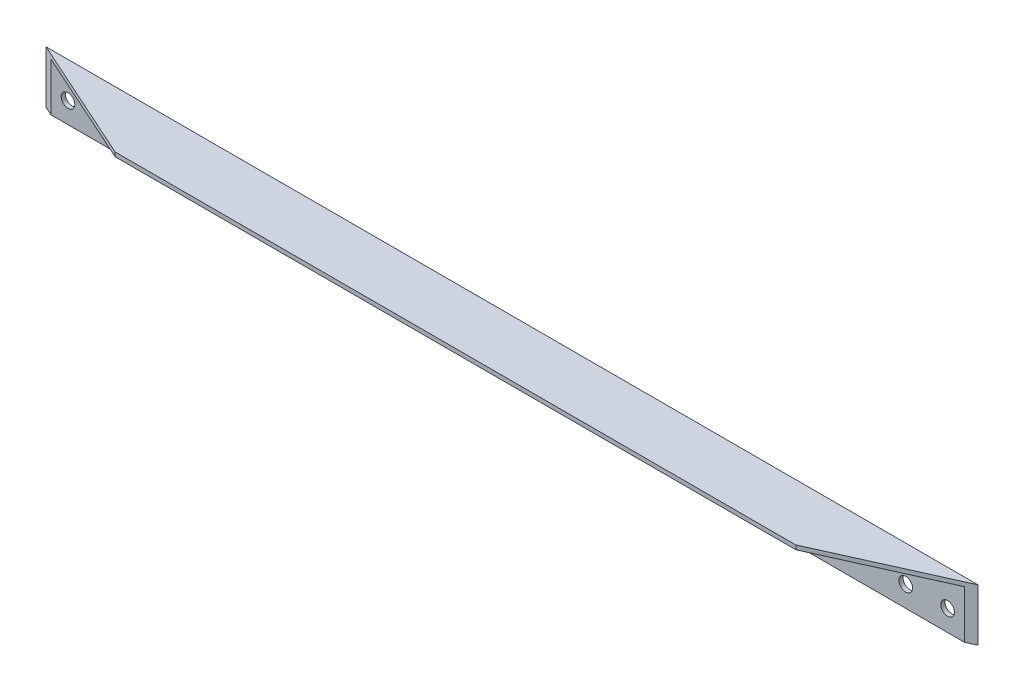
ISO-10303-21;
HEADER;
FILE_DESCRIPTION(('STEP AP214'),'2;1');
FILE_NAME('part.step','',(''),(''),'','','');
FILE_SCHEMA(('AUTOMOTIVE_DESIGN { 1 0 10303 214 1 1 1 1 }'));
ENDSEC;
DATA;
#1=APPLICATION_CONTEXT('core data for automotive mechanical design processes');
#2=APPLICATION_PROTOCOL_DEFINITION('international standard','automotive_design',2000,#1);
#3=PRODUCT_CONTEXT('',#1,'mechanical');
#4=PRODUCT('Part','Part','',(#3));
#5=PRODUCT_RELATED_PRODUCT_CATEGORY('part','',(#4));
#6=PRODUCT_DEFINITION_FORMATION('','',#4);
#7=PRODUCT_DEFINITION_CONTEXT('part definition',#1,'design');
#8=PRODUCT_DEFINITION('design','',#6,#7);
#9=PRODUCT_DEFINITION_SHAPE('','',#8);
#10=(LENGTH_UNIT() NAMED_UNIT(*) SI_UNIT(.MILLI.,.METRE.));
#11=(NAMED_UNIT(*) PLANE_ANGLE_UNIT() SI_UNIT($,.RADIAN.));
#12=(NAMED_UNIT(*) SI_UNIT($,.STERADIAN.) SOLID_ANGLE_UNIT());
#13=UNCERTAINTY_MEASURE_WITH_UNIT(LENGTH_MEASURE(1.E-05),#10,'distance_accuracy_value','');
#14=(GEOMETRIC_REPRESENTATION_CONTEXT(3) GLOBAL_UNCERTAINTY_ASSIGNED_CONTEXT((#13)) GLOBAL_UNIT_ASSIGNED_CONTEXT((#10,
#11,#12)) REPRESENTATION_CONTEXT('',''));
#15=CARTESIAN_POINT('',(0.,0.,0.));
#16=DIRECTION('',(0.,0.,1.));
#17=DIRECTION('',(1.,0.,0.));
#18=AXIS2_PLACEMENT_3D('',#15,#16,#17);
#19=CARTESIAN_POINT('',(-890.,100.,8.));
#20=DIRECTION('',(0.,0.,-1.));
#21=DIRECTION('',(-1.,0.,0.));
#22=AXIS2_PLACEMENT_3D('',#19,#20,#21);
#23=PLANE('',#22);
#24=CARTESIAN_POINT('',(-760.,39.9999999999999,8.));
#25=DIRECTION('',(0.,0.,1.));
#26=DIRECTION('',(-1.,0.,0.));
#27=AXIS2_PLACEMENT_3D('',#24,#25,#26);
#28=CIRCLE('',#27,12.9999999999998);
#29=CARTESIAN_POINT('',(-773.,39.9999999999999,8.));
#30=VERTEX_POINT('',#29);
#31=EDGE_CURVE('E134',#30,#30,#28,.T.);
#32=ORIENTED_EDGE('',*,*,#31,.F.);
#33=EDGE_LOOP('',(#32));
#34=FACE_BOUND('',#33,.T.);
#35=CARTESIAN_POINT('',(-840.,39.9999999999999,8.));
#36=DIRECTION('',(0.,0.,1.));
#37=DIRECTION('',(-1.,0.,0.));
#38=AXIS2_PLACEMENT_3D('',#35,#36,#37);
#39=CIRCLE('',#38,12.9999999999998);
#40=CARTESIAN_POINT('',(-853.,39.9999999999999,8.));
#41=VERTEX_POINT('',#40);
#42=EDGE_CURVE('E128',#41,#41,#39,.T.);
#43=ORIENTED_EDGE('',*,*,#42,.F.);
#44=EDGE_LOOP('',(#43));
#45=FACE_BOUND('',#44,.T.);
#46=CARTESIAN_POINT('',(760.,39.9999999999999,8.));
#47=DIRECTION('',(0.,0.,1.));
#48=DIRECTION('',(1.,0.,0.));
#49=AXIS2_PLACEMENT_3D('',#46,#47,#48);
#50=CIRCLE('',#49,12.9999999999998);
#51=CARTESIAN_POINT('',(773.,39.9999999999999,8.));
#52=VERTEX_POINT('',#51);
#53=EDGE_CURVE('E122',#52,#52,#50,.T.);
#54=ORIENTED_EDGE('',*,*,#53,.F.);
#55=EDGE_LOOP('',(#54));
#56=FACE_BOUND('',#55,.T.);
#57=CARTESIAN_POINT('',(840.,39.9999999999999,8.));
#58=DIRECTION('',(0.,0.,1.));
#59=DIRECTION('',(1.,0.,0.));
#60=AXIS2_PLACEMENT_3D('',#57,#58,#59);
#61=CIRCLE('',#60,12.9999999999998);
#62=CARTESIAN_POINT('',(853.,39.9999999999999,8.));
#63=VERTEX_POINT('',#62);
#64=EDGE_CURVE('E96',#63,#63,#61,.T.);
#65=ORIENTED_EDGE('',*,*,#64,.F.);
#66=EDGE_LOOP('',(#65));
#67=FACE_BOUND('',#66,.T.);
#68=DIRECTION('',(1.,0.,0.));
#69=VECTOR('',#68,1.);
#70=CARTESIAN_POINT('',(-890.,92.,8.));
#71=LINE('',#70,#69);
#72=CARTESIAN_POINT('',(-872.222222222222,92.,8.));
#73=VERTEX_POINT('',#72);
#74=CARTESIAN_POINT('',(872.222222222222,92.,8.00000000000001));
#75=VERTEX_POINT('',#74);
#76=EDGE_CURVE('E143',#73,#75,#71,.T.);
#77=ORIENTED_EDGE('',*,*,#76,.F.);
#78=DIRECTION('',(0.,-1.,0.));
#79=VECTOR('',#78,1.);
#80=CARTESIAN_POINT('',(-872.222222222222,100.,8.));
#81=LINE('',#80,#79);
#82=CARTESIAN_POINT('',(-872.222222222222,0.,7.99999999999999));
#83=VERTEX_POINT('',#82);
#84=EDGE_CURVE('E155',#73,#83,#81,.T.);
#85=ORIENTED_EDGE('',*,*,#84,.T.);
#86=DIRECTION('',(1.,0.,0.));
#87=VECTOR('',#86,1.);
#88=CARTESIAN_POINT('',(-890.,0.,8.));
#89=LINE('',#88,#87);
#90=CARTESIAN_POINT('',(872.222222222222,0.,7.99999999999995));
#91=VERTEX_POINT('',#90);
#92=EDGE_CURVE('E103',#83,#91,#89,.T.);
#93=ORIENTED_EDGE('',*,*,#92,.T.);
#94=DIRECTION('',(0.,1.,0.));
#95=VECTOR('',#94,1.);
#96=CARTESIAN_POINT('',(872.222222222222,100.,8.));
#97=LINE('',#96,#95);
#98=EDGE_CURVE('E146',#91,#75,#97,.T.);
#99=ORIENTED_EDGE('',*,*,#98,.T.);
#100=EDGE_LOOP('',(#77,#85,#93,#99));
#101=FACE_BOUND('',#100,.T.);
#102=ADVANCED_FACE('F33',(#34,#45,#56,#67,#101),#23,.F.);
#103=CARTESIAN_POINT('',(-890.,100.,0.));
#104=DIRECTION('',(0.,0.,-1.));
#105=DIRECTION('',(-1.,0.,0.));
#106=AXIS2_PLACEMENT_3D('',#103,#104,#105);
#107=PLANE('',#106);
#108=CARTESIAN_POINT('',(-840.,39.9999999999999,0.));
#109=DIRECTION('',(0.,0.,1.));
#110=DIRECTION('',(-1.,0.,0.));
#111=AXIS2_PLACEMENT_3D('',#108,#109,#110);
#112=CIRCLE('',#111,12.9999999999998);
#113=CARTESIAN_POINT('',(-853.,39.9999999999999,0.));
#114=VERTEX_POINT('',#113);
#115=EDGE_CURVE('E131',#114,#114,#112,.T.);
#116=ORIENTED_EDGE('',*,*,#115,.T.);
#117=EDGE_LOOP('',(#116));
#118=FACE_BOUND('',#117,.T.);
#119=CARTESIAN_POINT('',(840.,39.9999999999999,0.));
#120=DIRECTION('',(0.,0.,1.));
#121=DIRECTION('',(1.,0.,0.));
#122=AXIS2_PLACEMENT_3D('',#119,#120,#121);
#123=CIRCLE('',#122,12.9999999999998);
#124=CARTESIAN_POINT('',(853.,39.9999999999999,0.));
#125=VERTEX_POINT('',#124);
#126=EDGE_CURVE('E119',#125,#125,#123,.T.);
#127=ORIENTED_EDGE('',*,*,#126,.T.);
#128=EDGE_LOOP('',(#127));
#129=FACE_BOUND('',#128,.T.);
#130=DIRECTION('',(0.,-1.,0.));
#131=VECTOR('',#130,1.);
#132=CARTESIAN_POINT('',(-890.,0.,0.));
#133=LINE('',#132,#131);
#134=CARTESIAN_POINT('',(-890.,100.,0.));
#135=VERTEX_POINT('',#134);
#136=CARTESIAN_POINT('',(-890.,0.,0.));
#137=VERTEX_POINT('',#136);
#138=EDGE_CURVE('E84',#135,#137,#133,.T.);
#139=ORIENTED_EDGE('',*,*,#138,.F.);
#140=DIRECTION('',(-1.,0.,0.));
#141=VECTOR('',#140,1.);
#142=CARTESIAN_POINT('',(-890.,100.,0.));
#143=LINE('',#142,#141);
#144=CARTESIAN_POINT('',(890.,100.,0.));
#145=VERTEX_POINT('',#144);
#146=EDGE_CURVE('E109',#145,#135,#143,.T.);
#147=ORIENTED_EDGE('',*,*,#146,.F.);
#148=DIRECTION('',(0.,1.,0.));
#149=VECTOR('',#148,1.);
#150=CARTESIAN_POINT('',(890.,0.,0.));
#151=LINE('',#150,#149);
#152=CARTESIAN_POINT('',(890.,0.,0.));
#153=VERTEX_POINT('',#152);
#154=EDGE_CURVE('E107',#153,#145,#151,.T.);
#155=ORIENTED_EDGE('',*,*,#154,.F.);
#156=DIRECTION('',(1.,0.,0.));
#157=VECTOR('',#156,1.);
#158=CARTESIAN_POINT('',(-890.,0.,0.));
#159=LINE('',#158,#157);
#160=EDGE_CURVE('E95',#137,#153,#159,.T.);
#161=ORIENTED_EDGE('',*,*,#160,.F.);
#162=EDGE_LOOP('',(#139,#147,#155,#161));
#163=FACE_BOUND('',#162,.T.);
#164=CARTESIAN_POINT('',(760.,39.9999999999999,0.));
#165=DIRECTION('',(0.,0.,1.));
#166=DIRECTION('',(1.,0.,0.));
#167=AXIS2_PLACEMENT_3D('',#164,#165,#166);
#168=CIRCLE('',#167,12.9999999999998);
#169=CARTESIAN_POINT('',(773.,39.9999999999999,0.));
#170=VERTEX_POINT('',#169);
#171=EDGE_CURVE('E125',#170,#170,#168,.T.);
#172=ORIENTED_EDGE('',*,*,#171,.T.);
#173=EDGE_LOOP('',(#172));
#174=FACE_BOUND('',#173,.T.);
#175=CARTESIAN_POINT('',(-760.,39.9999999999999,0.));
#176=DIRECTION('',(0.,0.,1.));
#177=DIRECTION('',(-1.,0.,0.));
#178=AXIS2_PLACEMENT_3D('',#175,#176,#177);
#179=CIRCLE('',#178,12.9999999999998);
#180=CARTESIAN_POINT('',(-773.,39.9999999999999,0.));
#181=VERTEX_POINT('',#180);
#182=EDGE_CURVE('E137',#181,#181,#179,.T.);
#183=ORIENTED_EDGE('',*,*,#182,.T.);
#184=EDGE_LOOP('',(#183));
#185=FACE_BOUND('',#184,.T.);
#186=ADVANCED_FACE('F105',(#118,#129,#163,#174,#185),#107,.T.);
#187=CARTESIAN_POINT('',(-890.,0.,8.));
#188=DIRECTION('',(0.,1.,0.));
#189=DIRECTION('',(0.,0.,1.));
#190=AXIS2_PLACEMENT_3D('',#187,#188,#189);
#191=PLANE('',#190);
#192=ORIENTED_EDGE('',*,*,#92,.F.);
#193=DIRECTION('',(-0.911921505175107,0.,-0.410364677328798));
#194=VECTOR('',#193,1.);
#195=CARTESIAN_POINT('',(-650.,0.,108.));
#196=LINE('',#195,#194);
#197=EDGE_CURVE('E87',#83,#137,#196,.T.);
#198=ORIENTED_EDGE('',*,*,#197,.T.);
#199=ORIENTED_EDGE('',*,*,#160,.T.);
#200=DIRECTION('',(-0.911921505175107,0.,0.410364677328798));
#201=VECTOR('',#200,1.);
#202=CARTESIAN_POINT('',(650.,0.,108.));
#203=LINE('',#202,#201);
#204=EDGE_CURVE('E153',#153,#91,#203,.T.);
#205=ORIENTED_EDGE('',*,*,#204,.T.);
#206=EDGE_LOOP('',(#192,#198,#199,#205));
#207=FACE_BOUND('',#206,.T.);
#208=ADVANCED_FACE('F35',(#207),#191,.F.);
#209=CARTESIAN_POINT('',(-890.,100.,8.));
#210=DIRECTION('',(0.,-1.,0.));
#211=DIRECTION('',(0.,0.,-1.));
#212=AXIS2_PLACEMENT_3D('',#209,#210,#211);
#213=PLANE('',#212);
#214=ORIENTED_EDGE('',*,*,#146,.T.);
#215=DIRECTION('',(-0.911921505175107,0.,-0.410364677328798));
#216=VECTOR('',#215,1.);
#217=CARTESIAN_POINT('',(-650.,100.,108.));
#218=LINE('',#217,#216);
#219=CARTESIAN_POINT('',(-650.,100.,108.));
#220=VERTEX_POINT('',#219);
#221=EDGE_CURVE('E90',#220,#135,#218,.T.);
#222=ORIENTED_EDGE('',*,*,#221,.F.);
#223=DIRECTION('',(-1.,0.,0.));
#224=VECTOR('',#223,1.);
#225=CARTESIAN_POINT('',(-890.,100.,108.));
#226=LINE('',#225,#224);
#227=CARTESIAN_POINT('',(650.,100.,108.));
#228=VERTEX_POINT('',#227);
#229=EDGE_CURVE('E140',#228,#220,#226,.T.);
#230=ORIENTED_EDGE('',*,*,#229,.F.);
#231=DIRECTION('',(-0.911921505175107,0.,0.410364677328798));
#232=VECTOR('',#231,1.);
#233=CARTESIAN_POINT('',(650.,100.,108.));
#234=LINE('',#233,#232);
#235=EDGE_CURVE('E55',#145,#228,#234,.T.);
#236=ORIENTED_EDGE('',*,*,#235,.F.);
#237=EDGE_LOOP('',(#214,#222,#230,#236));
#238=FACE_BOUND('',#237,.T.);
#239=ADVANCED_FACE('F166',(#238),#213,.F.);
#240=CARTESIAN_POINT('',(840.,39.9999999999999,8.));
#241=DIRECTION('',(0.,0.,-1.));
#242=DIRECTION('',(-1.,0.,0.));
#243=AXIS2_PLACEMENT_3D('',#240,#241,#242);
#244=CYLINDRICAL_SURFACE('',#243,12.9999999999998);
#245=ORIENTED_EDGE('',*,*,#64,.T.);
#246=EDGE_LOOP('',(#245));
#247=FACE_BOUND('',#246,.T.);
#248=ORIENTED_EDGE('',*,*,#126,.F.);
#249=EDGE_LOOP('',(#248));
#250=FACE_BOUND('',#249,.T.);
#251=ADVANCED_FACE('F189',(#247,#250),#244,.F.);
#252=CARTESIAN_POINT('',(760.,39.9999999999999,8.));
#253=DIRECTION('',(0.,0.,-1.));
#254=DIRECTION('',(-1.,0.,0.));
#255=AXIS2_PLACEMENT_3D('',#252,#253,#254);
#256=CYLINDRICAL_SURFACE('',#255,12.9999999999998);
#257=ORIENTED_EDGE('',*,*,#53,.T.);
#258=EDGE_LOOP('',(#257));
#259=FACE_BOUND('',#258,.T.);
#260=ORIENTED_EDGE('',*,*,#171,.F.);
#261=EDGE_LOOP('',(#260));
#262=FACE_BOUND('',#261,.T.);
#263=ADVANCED_FACE('F196',(#259,#262),#256,.F.);
#264=CARTESIAN_POINT('',(-840.,39.9999999999999,8.));
#265=DIRECTION('',(0.,0.,-1.));
#266=DIRECTION('',(-1.,0.,0.));
#267=AXIS2_PLACEMENT_3D('',#264,#265,#266);
#268=CYLINDRICAL_SURFACE('',#267,12.9999999999998);
#269=ORIENTED_EDGE('',*,*,#42,.T.);
#270=EDGE_LOOP('',(#269));
#271=FACE_BOUND('',#270,.T.);
#272=ORIENTED_EDGE('',*,*,#115,.F.);
#273=EDGE_LOOP('',(#272));
#274=FACE_BOUND('',#273,.T.);
#275=ADVANCED_FACE('F218',(#271,#274),#268,.F.);
#276=CARTESIAN_POINT('',(-760.,39.9999999999999,8.));
#277=DIRECTION('',(0.,0.,-1.));
#278=DIRECTION('',(-1.,0.,0.));
#279=AXIS2_PLACEMENT_3D('',#276,#277,#278);
#280=CYLINDRICAL_SURFACE('',#279,12.9999999999998);
#281=ORIENTED_EDGE('',*,*,#31,.T.);
#282=EDGE_LOOP('',(#281));
#283=FACE_BOUND('',#282,.T.);
#284=ORIENTED_EDGE('',*,*,#182,.F.);
#285=EDGE_LOOP('',(#284));
#286=FACE_BOUND('',#285,.T.);
#287=ADVANCED_FACE('F176',(#283,#286),#280,.F.);
#288=CARTESIAN_POINT('',(-890.,92.,108.));
#289=DIRECTION('',(0.,1.,0.));
#290=DIRECTION('',(0.,0.,1.));
#291=AXIS2_PLACEMENT_3D('',#288,#289,#290);
#292=PLANE('',#291);
#293=DIRECTION('',(1.,0.,0.));
#294=VECTOR('',#293,1.);
#295=CARTESIAN_POINT('',(-890.,92.,108.));
#296=LINE('',#295,#294);
#297=CARTESIAN_POINT('',(-650.,92.,108.));
#298=VERTEX_POINT('',#297);
#299=CARTESIAN_POINT('',(650.,92.,108.));
#300=VERTEX_POINT('',#299);
#301=EDGE_CURVE('E145',#298,#300,#296,.T.);
#302=ORIENTED_EDGE('',*,*,#301,.F.);
#303=DIRECTION('',(-0.911921505175107,0.,-0.410364677328798));
#304=VECTOR('',#303,1.);
#305=CARTESIAN_POINT('',(-849.5841995842,92.,18.1871101871102));
#306=LINE('',#305,#304);
#307=EDGE_CURVE('E47',#298,#73,#306,.T.);
#308=ORIENTED_EDGE('',*,*,#307,.T.);
#309=ORIENTED_EDGE('',*,*,#76,.T.);
#310=DIRECTION('',(-0.911921505175107,0.,0.410364677328798));
#311=VECTOR('',#310,1.);
#312=CARTESIAN_POINT('',(-630.665280665281,92.,684.299376299376));
#313=LINE('',#312,#311);
#314=EDGE_CURVE('E151',#75,#300,#313,.T.);
#315=ORIENTED_EDGE('',*,*,#314,.T.);
#316=EDGE_LOOP('',(#302,#308,#309,#315));
#317=FACE_BOUND('',#316,.T.);
#318=ADVANCED_FACE('F162',(#317),#292,.F.);
#319=CARTESIAN_POINT('',(-890.,92.,108.));
#320=DIRECTION('',(0.,0.,1.));
#321=DIRECTION('',(1.,0.,0.));
#322=AXIS2_PLACEMENT_3D('',#319,#320,#321);
#323=PLANE('',#322);
#324=DIRECTION('',(0.,1.,0.));
#325=VECTOR('',#324,1.);
#326=CARTESIAN_POINT('',(-650.,92.,108.));
#327=LINE('',#326,#325);
#328=EDGE_CURVE('E11',#298,#220,#327,.T.);
#329=ORIENTED_EDGE('',*,*,#328,.F.);
#330=ORIENTED_EDGE('',*,*,#301,.T.);
#331=DIRECTION('',(0.,-1.,0.));
#332=VECTOR('',#331,1.);
#333=CARTESIAN_POINT('',(650.,92.,108.));
#334=LINE('',#333,#332);
#335=EDGE_CURVE('E41',#228,#300,#334,.T.);
#336=ORIENTED_EDGE('',*,*,#335,.F.);
#337=ORIENTED_EDGE('',*,*,#229,.T.);
#338=EDGE_LOOP('',(#329,#330,#336,#337));
#339=FACE_BOUND('',#338,.T.);
#340=ADVANCED_FACE('F168',(#339),#323,.T.);
#341=CARTESIAN_POINT('',(650.,0.,108.));
#342=DIRECTION('',(-0.410364677328798,0.,-0.911921505175106));
#343=DIRECTION('',(-0.911921505175107,0.,0.410364677328798));
#344=AXIS2_PLACEMENT_3D('',#341,#342,#343);
#345=PLANE('',#344);
#346=ORIENTED_EDGE('',*,*,#204,.F.);
#347=ORIENTED_EDGE('',*,*,#154,.T.);
#348=ORIENTED_EDGE('',*,*,#235,.T.);
#349=ORIENTED_EDGE('',*,*,#335,.T.);
#350=ORIENTED_EDGE('',*,*,#314,.F.);
#351=ORIENTED_EDGE('',*,*,#98,.F.);
#352=EDGE_LOOP('',(#346,#347,#348,#349,#350,#351));
#353=FACE_BOUND('',#352,.T.);
#354=ADVANCED_FACE('F163',(#353),#345,.F.);
#355=CARTESIAN_POINT('',(-650.,0.,108.));
#356=DIRECTION('',(0.410364677328798,0.,-0.911921505175106));
#357=DIRECTION('',(-0.911921505175107,0.,-0.410364677328798));
#358=AXIS2_PLACEMENT_3D('',#355,#356,#357);
#359=PLANE('',#358);
#360=ORIENTED_EDGE('',*,*,#307,.F.);
#361=ORIENTED_EDGE('',*,*,#328,.T.);
#362=ORIENTED_EDGE('',*,*,#221,.T.);
#363=ORIENTED_EDGE('',*,*,#138,.T.);
#364=ORIENTED_EDGE('',*,*,#197,.F.);
#365=ORIENTED_EDGE('',*,*,#84,.F.);
#366=EDGE_LOOP('',(#360,#361,#362,#363,#364,#365));
#367=FACE_BOUND('',#366,.T.);
#368=ADVANCED_FACE('F86',(#367),#359,.F.);
#369=CLOSED_SHELL('',(#102,#186,#208,#239,#251,#263,#275,#287,#318,#340,#354,#368));
#370=MANIFOLD_SOLID_BREP('B2',#369);
#371=ADVANCED_BREP_SHAPE_REPRESENTATION('',(#18,#370),#14);
#372=SHAPE_DEFINITION_REPRESENTATION(#9,#371);
ENDSEC;
END-ISO-10303-21;
